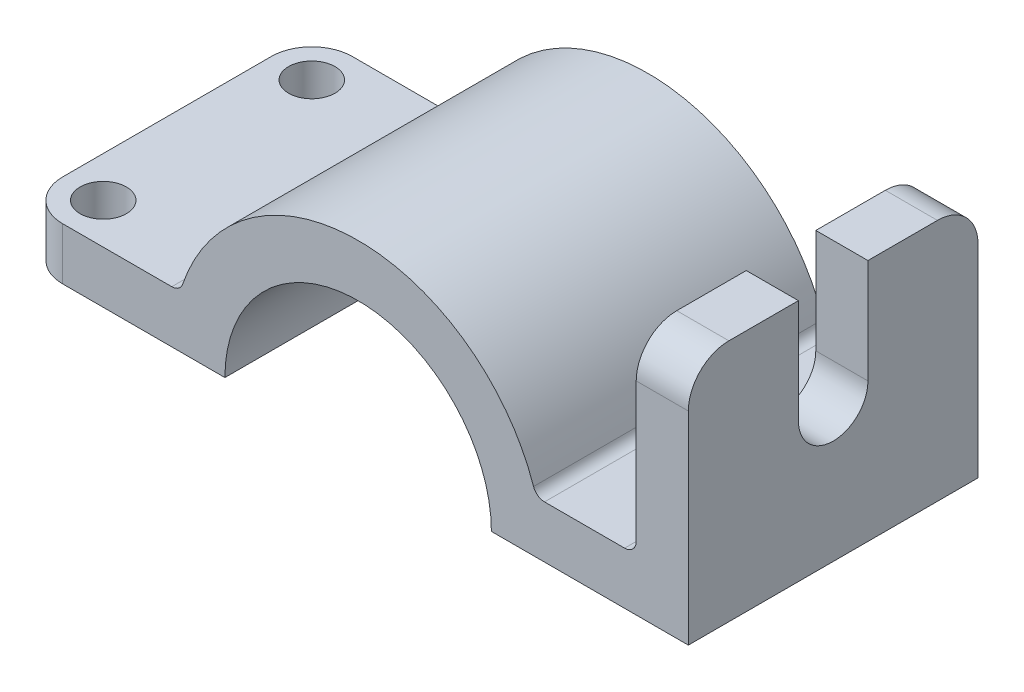
ISO-10303-21;
HEADER;
FILE_DESCRIPTION(('STEP AP214'),'2;1');
FILE_NAME('part.step','',(''),(''),'','','');
FILE_SCHEMA(('AUTOMOTIVE_DESIGN { 1 0 10303 214 1 1 1 1 }'));
ENDSEC;
DATA;
#1=APPLICATION_CONTEXT('core data for automotive mechanical design processes');
#2=APPLICATION_PROTOCOL_DEFINITION('international standard','automotive_design',2000,#1);
#3=PRODUCT_CONTEXT('',#1,'mechanical');
#4=PRODUCT('Part','Part','',(#3));
#5=PRODUCT_RELATED_PRODUCT_CATEGORY('part','',(#4));
#6=PRODUCT_DEFINITION_FORMATION('','',#4);
#7=PRODUCT_DEFINITION_CONTEXT('part definition',#1,'design');
#8=PRODUCT_DEFINITION('design','',#6,#7);
#9=PRODUCT_DEFINITION_SHAPE('','',#8);
#10=(LENGTH_UNIT() NAMED_UNIT(*) SI_UNIT(.MILLI.,.METRE.));
#11=(NAMED_UNIT(*) PLANE_ANGLE_UNIT() SI_UNIT($,.RADIAN.));
#12=(NAMED_UNIT(*) SI_UNIT($,.STERADIAN.) SOLID_ANGLE_UNIT());
#13=UNCERTAINTY_MEASURE_WITH_UNIT(LENGTH_MEASURE(1.E-05),#10,'distance_accuracy_value','');
#14=(GEOMETRIC_REPRESENTATION_CONTEXT(3) GLOBAL_UNCERTAINTY_ASSIGNED_CONTEXT((#13)) GLOBAL_UNIT_ASSIGNED_CONTEXT((#10,
#11,#12)) REPRESENTATION_CONTEXT('',''));
#15=CARTESIAN_POINT('',(0.,0.,0.));
#16=DIRECTION('',(0.,0.,1.));
#17=DIRECTION('',(1.,0.,0.));
#18=AXIS2_PLACEMENT_3D('',#15,#16,#17);
#19=CARTESIAN_POINT('',(57.,42.,25.));
#20=DIRECTION('',(0.,-1.,0.));
#21=DIRECTION('',(1.,0.,0.));
#22=AXIS2_PLACEMENT_3D('',#19,#20,#21);
#23=PLANE('',#22);
#24=DIRECTION('',(0.,0.,-1.));
#25=VECTOR('',#24,1.);
#26=CARTESIAN_POINT('',(48.,42.,25.));
#27=LINE('',#26,#25);
#28=CARTESIAN_POINT('',(48.,42.,18.));
#29=VERTEX_POINT('',#28);
#30=CARTESIAN_POINT('',(48.,42.,6.));
#31=VERTEX_POINT('',#30);
#32=EDGE_CURVE('E300',#29,#31,#27,.T.);
#33=ORIENTED_EDGE('',*,*,#32,.F.);
#34=DIRECTION('',(-1.,0.,0.));
#35=VECTOR('',#34,1.);
#36=CARTESIAN_POINT('',(57.,42.,18.));
#37=LINE('',#36,#35);
#38=CARTESIAN_POINT('',(57.,42.,18.));
#39=VERTEX_POINT('',#38);
#40=EDGE_CURVE('E11',#29,#39,#37,.F.);
#41=ORIENTED_EDGE('',*,*,#40,.T.);
#42=DIRECTION('',(0.,0.,-1.));
#43=VECTOR('',#42,1.);
#44=CARTESIAN_POINT('',(57.,42.,25.));
#45=LINE('',#44,#43);
#46=CARTESIAN_POINT('',(57.,42.,6.));
#47=VERTEX_POINT('',#46);
#48=EDGE_CURVE('E297',#39,#47,#45,.T.);
#49=ORIENTED_EDGE('',*,*,#48,.T.);
#50=DIRECTION('',(1.,0.,0.));
#51=VECTOR('',#50,1.);
#52=CARTESIAN_POINT('',(21.1671842700025,42.,6.));
#53=LINE('',#52,#51);
#54=EDGE_CURVE('E214',#31,#47,#53,.T.);
#55=ORIENTED_EDGE('',*,*,#54,.F.);
#56=EDGE_LOOP('',(#33,#41,#49,#55));
#57=FACE_BOUND('',#56,.T.);
#58=ADVANCED_FACE('F41',(#57),#23,.F.);
#59=CARTESIAN_POINT('',(57.,0.,25.));
#60=DIRECTION('',(-1.,0.,0.));
#61=DIRECTION('',(0.,0.,1.));
#62=AXIS2_PLACEMENT_3D('',#59,#60,#61);
#63=PLANE('',#62);
#64=DIRECTION('',(0.,1.,0.));
#65=VECTOR('',#64,1.);
#66=CARTESIAN_POINT('',(57.,0.,-25.));
#67=LINE('',#66,#65);
#68=CARTESIAN_POINT('',(57.,0.,-25.));
#69=VERTEX_POINT('',#68);
#70=CARTESIAN_POINT('',(57.,35.,-25.));
#71=VERTEX_POINT('',#70);
#72=EDGE_CURVE('E251',#69,#71,#67,.T.);
#73=ORIENTED_EDGE('',*,*,#72,.T.);
#74=CARTESIAN_POINT('',(57.,35.,-18.));
#75=DIRECTION('',(-1.,0.,0.));
#76=DIRECTION('',(0.,0.,1.));
#77=AXIS2_PLACEMENT_3D('',#74,#75,#76);
#78=CIRCLE('',#77,7.);
#79=CARTESIAN_POINT('',(57.,42.,-18.));
#80=VERTEX_POINT('',#79);
#81=EDGE_CURVE('E47',#71,#80,#78,.F.);
#82=ORIENTED_EDGE('',*,*,#81,.T.);
#83=CARTESIAN_POINT('',(57.,42.,-6.));
#84=VERTEX_POINT('',#83);
#85=EDGE_CURVE('E208',#84,#80,#45,.T.);
#86=ORIENTED_EDGE('',*,*,#85,.F.);
#87=DIRECTION('',(0.,1.,0.));
#88=VECTOR('',#87,1.);
#89=CARTESIAN_POINT('',(57.,24.,-6.));
#90=LINE('',#89,#88);
#91=CARTESIAN_POINT('',(57.,24.,-6.));
#92=VERTEX_POINT('',#91);
#93=EDGE_CURVE('E183',#92,#84,#90,.T.);
#94=ORIENTED_EDGE('',*,*,#93,.F.);
#95=CARTESIAN_POINT('',(57.,24.,0.));
#96=DIRECTION('',(1.,0.,0.));
#97=DIRECTION('',(0.,0.,-1.));
#98=AXIS2_PLACEMENT_3D('',#95,#96,#97);
#99=CIRCLE('',#98,6.);
#100=CARTESIAN_POINT('',(57.,24.,6.));
#101=VERTEX_POINT('',#100);
#102=EDGE_CURVE('E195',#101,#92,#99,.T.);
#103=ORIENTED_EDGE('',*,*,#102,.F.);
#104=DIRECTION('',(0.,-1.,0.));
#105=VECTOR('',#104,1.);
#106=CARTESIAN_POINT('',(57.,24.,6.));
#107=LINE('',#106,#105);
#108=EDGE_CURVE('E192',#47,#101,#107,.T.);
#109=ORIENTED_EDGE('',*,*,#108,.F.);
#110=ORIENTED_EDGE('',*,*,#48,.F.);
#111=CARTESIAN_POINT('',(57.,35.,18.));
#112=DIRECTION('',(-1.,0.,0.));
#113=DIRECTION('',(0.,0.,1.));
#114=AXIS2_PLACEMENT_3D('',#111,#112,#113);
#115=CIRCLE('',#114,7.);
#116=CARTESIAN_POINT('',(57.,35.,25.));
#117=VERTEX_POINT('',#116);
#118=EDGE_CURVE('E336',#39,#117,#115,.F.);
#119=ORIENTED_EDGE('',*,*,#118,.T.);
#120=DIRECTION('',(0.,1.,0.));
#121=VECTOR('',#120,1.);
#122=CARTESIAN_POINT('',(57.,0.,25.));
#123=LINE('',#122,#121);
#124=CARTESIAN_POINT('',(57.,0.,25.));
#125=VERTEX_POINT('',#124);
#126=EDGE_CURVE('E230',#125,#117,#123,.T.);
#127=ORIENTED_EDGE('',*,*,#126,.F.);
#128=DIRECTION('',(0.,0.,-1.));
#129=VECTOR('',#128,1.);
#130=CARTESIAN_POINT('',(57.,0.,25.));
#131=LINE('',#130,#129);
#132=EDGE_CURVE('E302',#125,#69,#131,.T.);
#133=ORIENTED_EDGE('',*,*,#132,.T.);
#134=EDGE_LOOP('',(#73,#82,#86,#94,#103,#109,#110,#119,#127,#133));
#135=FACE_BOUND('',#134,.T.);
#136=ADVANCED_FACE('F206',(#135),#63,.F.);
#137=CARTESIAN_POINT('',(48.,42.,25.));
#138=DIRECTION('',(1.,0.,0.));
#139=DIRECTION('',(0.,1.,0.));
#140=AXIS2_PLACEMENT_3D('',#137,#138,#139);
#141=PLANE('',#140);
#142=CARTESIAN_POINT('',(48.,42.,-6.));
#143=VERTEX_POINT('',#142);
#144=CARTESIAN_POINT('',(48.,42.,-18.));
#145=VERTEX_POINT('',#144);
#146=EDGE_CURVE('E296',#143,#145,#27,.T.);
#147=ORIENTED_EDGE('',*,*,#146,.T.);
#148=CARTESIAN_POINT('',(48.,35.,-18.));
#149=DIRECTION('',(1.,0.,0.));
#150=DIRECTION('',(0.,1.,0.));
#151=AXIS2_PLACEMENT_3D('',#148,#149,#150);
#152=CIRCLE('',#151,7.);
#153=CARTESIAN_POINT('',(48.,35.,-25.));
#154=VERTEX_POINT('',#153);
#155=EDGE_CURVE('E333',#145,#154,#152,.F.);
#156=ORIENTED_EDGE('',*,*,#155,.T.);
#157=DIRECTION('',(0.,-1.,0.));
#158=VECTOR('',#157,1.);
#159=CARTESIAN_POINT('',(48.,42.,-25.));
#160=LINE('',#159,#158);
#161=CARTESIAN_POINT('',(48.,11.,-25.));
#162=VERTEX_POINT('',#161);
#163=EDGE_CURVE('E254',#154,#162,#160,.T.);
#164=ORIENTED_EDGE('',*,*,#163,.T.);
#165=DIRECTION('',(0.,0.,-1.));
#166=VECTOR('',#165,1.);
#167=CARTESIAN_POINT('',(48.,11.,25.));
#168=LINE('',#167,#166);
#169=CARTESIAN_POINT('',(48.,11.,25.));
#170=VERTEX_POINT('',#169);
#171=EDGE_CURVE('E294',#170,#162,#168,.T.);
#172=ORIENTED_EDGE('',*,*,#171,.F.);
#173=DIRECTION('',(0.,-1.,0.));
#174=VECTOR('',#173,1.);
#175=CARTESIAN_POINT('',(48.,42.,25.));
#176=LINE('',#175,#174);
#177=CARTESIAN_POINT('',(48.,35.,25.));
#178=VERTEX_POINT('',#177);
#179=EDGE_CURVE('E231',#178,#170,#176,.T.);
#180=ORIENTED_EDGE('',*,*,#179,.F.);
#181=CARTESIAN_POINT('',(48.,35.,18.));
#182=DIRECTION('',(1.,0.,0.));
#183=DIRECTION('',(0.,1.,0.));
#184=AXIS2_PLACEMENT_3D('',#181,#182,#183);
#185=CIRCLE('',#184,7.);
#186=EDGE_CURVE('E61',#178,#29,#185,.F.);
#187=ORIENTED_EDGE('',*,*,#186,.T.);
#188=ORIENTED_EDGE('',*,*,#32,.T.);
#189=DIRECTION('',(0.,1.,0.));
#190=VECTOR('',#189,1.);
#191=CARTESIAN_POINT('',(48.,24.,6.));
#192=LINE('',#191,#190);
#193=CARTESIAN_POINT('',(48.,24.,6.));
#194=VERTEX_POINT('',#193);
#195=EDGE_CURVE('E212',#194,#31,#192,.T.);
#196=ORIENTED_EDGE('',*,*,#195,.F.);
#197=CARTESIAN_POINT('',(48.,24.,0.));
#198=DIRECTION('',(1.,0.,0.));
#199=DIRECTION('',(0.,1.,0.));
#200=AXIS2_PLACEMENT_3D('',#197,#198,#199);
#201=CIRCLE('',#200,6.);
#202=CARTESIAN_POINT('',(48.,24.,-6.));
#203=VERTEX_POINT('',#202);
#204=EDGE_CURVE('E222',#203,#194,#201,.F.);
#205=ORIENTED_EDGE('',*,*,#204,.F.);
#206=DIRECTION('',(0.,-1.,0.));
#207=VECTOR('',#206,1.);
#208=CARTESIAN_POINT('',(48.,24.,-6.));
#209=LINE('',#208,#207);
#210=EDGE_CURVE('E190',#143,#203,#209,.T.);
#211=ORIENTED_EDGE('',*,*,#210,.F.);
#212=EDGE_LOOP('',(#147,#156,#164,#172,#180,#187,#188,#196,#205,#211));
#213=FACE_BOUND('',#212,.T.);
#214=ADVANCED_FACE('F349',(#213),#141,.F.);
#215=CARTESIAN_POINT('',(0.,0.,25.));
#216=DIRECTION('',(0.,0.,-1.));
#217=DIRECTION('',(-1.,0.,0.));
#218=AXIS2_PLACEMENT_3D('',#215,#216,#217);
#219=CYLINDRICAL_SURFACE('',#218,23.);
#220=CARTESIAN_POINT('',(0.,0.,-25.));
#221=DIRECTION('',(0.,0.,-1.));
#222=DIRECTION('',(-1.,0.,0.));
#223=AXIS2_PLACEMENT_3D('',#220,#221,#222);
#224=CIRCLE('',#223,23.);
#225=CARTESIAN_POINT('',(-23.,0.,-25.));
#226=VERTEX_POINT('',#225);
#227=CARTESIAN_POINT('',(23.,0.,-25.));
#228=VERTEX_POINT('',#227);
#229=EDGE_CURVE('E219',#226,#228,#224,.T.);
#230=ORIENTED_EDGE('',*,*,#229,.T.);
#231=DIRECTION('',(0.,0.,-1.));
#232=VECTOR('',#231,1.);
#233=CARTESIAN_POINT('',(23.,0.,25.));
#234=LINE('',#233,#232);
#235=CARTESIAN_POINT('',(23.,0.,25.));
#236=VERTEX_POINT('',#235);
#237=EDGE_CURVE('E305',#236,#228,#234,.T.);
#238=ORIENTED_EDGE('',*,*,#237,.F.);
#239=CARTESIAN_POINT('',(0.,0.,25.));
#240=DIRECTION('',(0.,0.,-1.));
#241=DIRECTION('',(-1.,0.,0.));
#242=AXIS2_PLACEMENT_3D('',#239,#240,#241);
#243=CIRCLE('',#242,23.);
#244=CARTESIAN_POINT('',(-23.,0.,25.));
#245=VERTEX_POINT('',#244);
#246=EDGE_CURVE('E225',#245,#236,#243,.T.);
#247=ORIENTED_EDGE('',*,*,#246,.F.);
#248=DIRECTION('',(0.,0.,-1.));
#249=VECTOR('',#248,1.);
#250=CARTESIAN_POINT('',(-23.,0.,25.));
#251=LINE('',#250,#249);
#252=EDGE_CURVE('E249',#245,#226,#251,.T.);
#253=ORIENTED_EDGE('',*,*,#252,.T.);
#254=EDGE_LOOP('',(#230,#238,#247,#253));
#255=FACE_BOUND('',#254,.T.);
#256=ADVANCED_FACE('F423',(#255),#219,.F.);
#257=CARTESIAN_POINT('',(23.,0.,25.));
#258=DIRECTION('',(0.,1.,0.));
#259=DIRECTION('',(0.,0.,1.));
#260=AXIS2_PLACEMENT_3D('',#257,#258,#259);
#261=PLANE('',#260);
#262=DIRECTION('',(1.,0.,0.));
#263=VECTOR('',#262,1.);
#264=CARTESIAN_POINT('',(23.,0.,-25.));
#265=LINE('',#264,#263);
#266=EDGE_CURVE('E253',#228,#69,#265,.T.);
#267=ORIENTED_EDGE('',*,*,#266,.T.);
#268=ORIENTED_EDGE('',*,*,#132,.F.);
#269=DIRECTION('',(1.,0.,0.));
#270=VECTOR('',#269,1.);
#271=CARTESIAN_POINT('',(23.,0.,25.));
#272=LINE('',#271,#270);
#273=EDGE_CURVE('E223',#236,#125,#272,.T.);
#274=ORIENTED_EDGE('',*,*,#273,.F.);
#275=ORIENTED_EDGE('',*,*,#237,.T.);
#276=EDGE_LOOP('',(#267,#268,#274,#275));
#277=FACE_BOUND('',#276,.T.);
#278=ADVANCED_FACE('F424',(#277),#261,.F.);
#279=ORIENTED_EDGE('',*,*,#85,.T.);
#280=DIRECTION('',(-1.,0.,0.));
#281=VECTOR('',#280,1.);
#282=CARTESIAN_POINT('',(48.,42.,-18.));
#283=LINE('',#282,#281);
#284=EDGE_CURVE('E332',#80,#145,#283,.T.);
#285=ORIENTED_EDGE('',*,*,#284,.T.);
#286=ORIENTED_EDGE('',*,*,#146,.F.);
#287=DIRECTION('',(1.,0.,0.));
#288=VECTOR('',#287,1.);
#289=CARTESIAN_POINT('',(21.1671842700025,42.,-6.));
#290=LINE('',#289,#288);
#291=EDGE_CURVE('E191',#143,#84,#290,.T.);
#292=ORIENTED_EDGE('',*,*,#291,.T.);
#293=EDGE_LOOP('',(#279,#285,#286,#292));
#294=FACE_BOUND('',#293,.T.);
#295=ADVANCED_FACE('F343',(#294),#23,.F.);
#296=CARTESIAN_POINT('',(46.,11.,25.));
#297=DIRECTION('',(0.,0.,-1.));
#298=DIRECTION('',(-1.,0.,0.));
#299=AXIS2_PLACEMENT_3D('',#296,#297,#298);
#300=CYLINDRICAL_SURFACE('',#299,2.);
#301=CARTESIAN_POINT('',(46.,11.,-25.));
#302=DIRECTION('',(0.,0.,-1.));
#303=DIRECTION('',(-1.,0.,0.));
#304=AXIS2_PLACEMENT_3D('',#301,#302,#303);
#305=CIRCLE('',#304,2.);
#306=CARTESIAN_POINT('',(46.,9.,-25.));
#307=VERTEX_POINT('',#306);
#308=EDGE_CURVE('E260',#162,#307,#305,.T.);
#309=ORIENTED_EDGE('',*,*,#308,.T.);
#310=DIRECTION('',(0.,0.,-1.));
#311=VECTOR('',#310,1.);
#312=CARTESIAN_POINT('',(46.,9.,25.));
#313=LINE('',#312,#311);
#314=CARTESIAN_POINT('',(46.,9.,25.));
#315=VERTEX_POINT('',#314);
#316=EDGE_CURVE('E292',#315,#307,#313,.T.);
#317=ORIENTED_EDGE('',*,*,#316,.F.);
#318=CARTESIAN_POINT('',(46.,11.,25.));
#319=DIRECTION('',(0.,0.,-1.));
#320=DIRECTION('',(-1.,0.,0.));
#321=AXIS2_PLACEMENT_3D('',#318,#319,#320);
#322=CIRCLE('',#321,2.);
#323=EDGE_CURVE('E234',#170,#315,#322,.T.);
#324=ORIENTED_EDGE('',*,*,#323,.F.);
#325=ORIENTED_EDGE('',*,*,#171,.T.);
#326=EDGE_LOOP('',(#309,#317,#324,#325));
#327=FACE_BOUND('',#326,.T.);
#328=ADVANCED_FACE('F358',(#327),#300,.F.);
#329=CARTESIAN_POINT('',(46.,9.,25.));
#330=DIRECTION('',(0.,-1.,0.));
#331=DIRECTION('',(1.,0.,0.));
#332=AXIS2_PLACEMENT_3D('',#329,#330,#331);
#333=PLANE('',#332);
#334=DIRECTION('',(-1.,0.,0.));
#335=VECTOR('',#334,1.);
#336=CARTESIAN_POINT('',(46.,9.,-25.));
#337=LINE('',#336,#335);
#338=CARTESIAN_POINT('',(32.1714158842908,9.,-25.));
#339=VERTEX_POINT('',#338);
#340=EDGE_CURVE('E259',#307,#339,#337,.T.);
#341=ORIENTED_EDGE('',*,*,#340,.T.);
#342=DIRECTION('',(0.,0.,-1.));
#343=VECTOR('',#342,1.);
#344=CARTESIAN_POINT('',(32.1714158842908,9.,25.));
#345=LINE('',#344,#343);
#346=CARTESIAN_POINT('',(32.1714158842908,9.,25.));
#347=VERTEX_POINT('',#346);
#348=EDGE_CURVE('E289',#347,#339,#345,.T.);
#349=ORIENTED_EDGE('',*,*,#348,.F.);
#350=DIRECTION('',(-1.,0.,0.));
#351=VECTOR('',#350,1.);
#352=CARTESIAN_POINT('',(46.,9.,25.));
#353=LINE('',#352,#351);
#354=EDGE_CURVE('E235',#315,#347,#353,.T.);
#355=ORIENTED_EDGE('',*,*,#354,.F.);
#356=ORIENTED_EDGE('',*,*,#316,.T.);
#357=EDGE_LOOP('',(#341,#349,#355,#356));
#358=FACE_BOUND('',#357,.T.);
#359=ADVANCED_FACE('F361',(#358),#333,.F.);
#360=CARTESIAN_POINT('',(32.1714158842908,11.,25.));
#361=DIRECTION('',(0.,0.,-1.));
#362=DIRECTION('',(-1.,0.,0.));
#363=AXIS2_PLACEMENT_3D('',#360,#361,#362);
#364=CYLINDRICAL_SURFACE('',#363,2.);
#365=CARTESIAN_POINT('',(32.1714158842908,11.,-25.));
#366=DIRECTION('',(0.,0.,-1.));
#367=DIRECTION('',(-1.,0.,0.));
#368=AXIS2_PLACEMENT_3D('',#365,#366,#367);
#369=CIRCLE('',#368,2.);
#370=CARTESIAN_POINT('',(30.2789796558031,10.3529411764706,-25.));
#371=VERTEX_POINT('',#370);
#372=EDGE_CURVE('E261',#339,#371,#369,.T.);
#373=ORIENTED_EDGE('',*,*,#372,.T.);
#374=DIRECTION('',(0.,0.,-1.));
#375=VECTOR('',#374,1.);
#376=CARTESIAN_POINT('',(30.2789796558031,10.3529411764706,25.));
#377=LINE('',#376,#375);
#378=CARTESIAN_POINT('',(30.2789796558031,10.3529411764706,25.));
#379=VERTEX_POINT('',#378);
#380=EDGE_CURVE('E282',#379,#371,#377,.T.);
#381=ORIENTED_EDGE('',*,*,#380,.F.);
#382=CARTESIAN_POINT('',(32.1714158842908,11.,25.));
#383=DIRECTION('',(0.,0.,-1.));
#384=DIRECTION('',(-1.,0.,0.));
#385=AXIS2_PLACEMENT_3D('',#382,#383,#384);
#386=CIRCLE('',#385,2.);
#387=EDGE_CURVE('E240',#347,#379,#386,.T.);
#388=ORIENTED_EDGE('',*,*,#387,.F.);
#389=ORIENTED_EDGE('',*,*,#348,.T.);
#390=EDGE_LOOP('',(#373,#381,#388,#389));
#391=FACE_BOUND('',#390,.T.);
#392=ADVANCED_FACE('F588',(#391),#364,.F.);
#393=CARTESIAN_POINT('',(0.,0.,25.));
#394=DIRECTION('',(0.,0.,-1.));
#395=DIRECTION('',(-1.,0.,0.));
#396=AXIS2_PLACEMENT_3D('',#393,#394,#395);
#397=CYLINDRICAL_SURFACE('',#396,32.);
#398=CARTESIAN_POINT('',(0.,0.,-25.));
#399=DIRECTION('',(0.,0.,1.));
#400=DIRECTION('',(-1.,0.,0.));
#401=AXIS2_PLACEMENT_3D('',#398,#399,#400);
#402=CIRCLE('',#401,32.);
#403=CARTESIAN_POINT('',(-30.2789796558031,10.3529411764706,-25.));
#404=VERTEX_POINT('',#403);
#405=EDGE_CURVE('E263',#371,#404,#402,.T.);
#406=ORIENTED_EDGE('',*,*,#405,.T.);
#407=DIRECTION('',(0.,0.,-1.));
#408=VECTOR('',#407,1.);
#409=CARTESIAN_POINT('',(-30.2789796558031,10.3529411764706,25.));
#410=LINE('',#409,#408);
#411=CARTESIAN_POINT('',(-30.2789796558031,10.3529411764706,25.));
#412=VERTEX_POINT('',#411);
#413=EDGE_CURVE('E281',#412,#404,#410,.T.);
#414=ORIENTED_EDGE('',*,*,#413,.F.);
#415=CARTESIAN_POINT('',(0.,0.,25.));
#416=DIRECTION('',(0.,0.,1.));
#417=DIRECTION('',(-1.,0.,0.));
#418=AXIS2_PLACEMENT_3D('',#415,#416,#417);
#419=CIRCLE('',#418,32.);
#420=EDGE_CURVE('E239',#379,#412,#419,.T.);
#421=ORIENTED_EDGE('',*,*,#420,.F.);
#422=ORIENTED_EDGE('',*,*,#380,.T.);
#423=EDGE_LOOP('',(#406,#414,#421,#422));
#424=FACE_BOUND('',#423,.T.);
#425=ADVANCED_FACE('F577',(#424),#397,.T.);
#426=CARTESIAN_POINT('',(-32.1714158842908,11.,25.));
#427=DIRECTION('',(0.,0.,-1.));
#428=DIRECTION('',(-1.,0.,0.));
#429=AXIS2_PLACEMENT_3D('',#426,#427,#428);
#430=CYLINDRICAL_SURFACE('',#429,2.);
#431=CARTESIAN_POINT('',(-32.1714158842908,11.,-25.));
#432=DIRECTION('',(0.,0.,-1.));
#433=DIRECTION('',(1.,0.,0.));
#434=AXIS2_PLACEMENT_3D('',#431,#432,#433);
#435=CIRCLE('',#434,2.);
#436=CARTESIAN_POINT('',(-32.1714158842908,9.,-25.));
#437=VERTEX_POINT('',#436);
#438=EDGE_CURVE('E264',#404,#437,#435,.T.);
#439=ORIENTED_EDGE('',*,*,#438,.T.);
#440=DIRECTION('',(0.,0.,-1.));
#441=VECTOR('',#440,1.);
#442=CARTESIAN_POINT('',(-32.1714158842908,9.,25.));
#443=LINE('',#442,#441);
#444=CARTESIAN_POINT('',(-32.1714158842908,9.,25.));
#445=VERTEX_POINT('',#444);
#446=EDGE_CURVE('E276',#445,#437,#443,.T.);
#447=ORIENTED_EDGE('',*,*,#446,.F.);
#448=CARTESIAN_POINT('',(-32.1714158842908,11.,25.));
#449=DIRECTION('',(0.,0.,-1.));
#450=DIRECTION('',(1.,0.,0.));
#451=AXIS2_PLACEMENT_3D('',#448,#449,#450);
#452=CIRCLE('',#451,2.);
#453=EDGE_CURVE('E244',#412,#445,#452,.T.);
#454=ORIENTED_EDGE('',*,*,#453,.F.);
#455=ORIENTED_EDGE('',*,*,#413,.T.);
#456=EDGE_LOOP('',(#439,#447,#454,#455));
#457=FACE_BOUND('',#456,.T.);
#458=ADVANCED_FACE('F399',(#457),#430,.F.);
#459=CARTESIAN_POINT('',(-58.,9.,25.));
#460=DIRECTION('',(0.,-1.,0.));
#461=DIRECTION('',(0.,0.,-1.));
#462=AXIS2_PLACEMENT_3D('',#459,#460,#461);
#463=PLANE('',#462);
#464=CARTESIAN_POINT('',(-51.,9.,-18.));
#465=DIRECTION('',(0.,1.,0.));
#466=DIRECTION('',(0.,0.,1.));
#467=AXIS2_PLACEMENT_3D('',#464,#465,#466);
#468=CIRCLE('',#467,4.);
#469=CARTESIAN_POINT('',(-51.,9.,-14.));
#470=VERTEX_POINT('',#469);
#471=EDGE_CURVE('E382',#470,#470,#468,.T.);
#472=ORIENTED_EDGE('',*,*,#471,.F.);
#473=EDGE_LOOP('',(#472));
#474=FACE_BOUND('',#473,.T.);
#475=CARTESIAN_POINT('',(-51.,9.,18.));
#476=DIRECTION('',(0.,1.,0.));
#477=DIRECTION('',(0.,0.,1.));
#478=AXIS2_PLACEMENT_3D('',#475,#476,#477);
#479=CIRCLE('',#478,4.);
#480=CARTESIAN_POINT('',(-51.,9.,22.));
#481=VERTEX_POINT('',#480);
#482=EDGE_CURVE('E383',#481,#481,#479,.T.);
#483=ORIENTED_EDGE('',*,*,#482,.F.);
#484=EDGE_LOOP('',(#483));
#485=FACE_BOUND('',#484,.T.);
#486=DIRECTION('',(0.,0.,-1.));
#487=VECTOR('',#486,1.);
#488=CARTESIAN_POINT('',(-58.,9.,25.));
#489=LINE('',#488,#487);
#490=CARTESIAN_POINT('',(-58.,9.,18.));
#491=VERTEX_POINT('',#490);
#492=CARTESIAN_POINT('',(-58.,9.,-18.));
#493=VERTEX_POINT('',#492);
#494=EDGE_CURVE('E277',#491,#493,#489,.T.);
#495=ORIENTED_EDGE('',*,*,#494,.F.);
#496=CARTESIAN_POINT('',(-51.,9.,18.));
#497=DIRECTION('',(0.,-1.,0.));
#498=DIRECTION('',(0.,0.,-1.));
#499=AXIS2_PLACEMENT_3D('',#496,#497,#498);
#500=CIRCLE('',#499,7.);
#501=CARTESIAN_POINT('',(-51.,9.,25.));
#502=VERTEX_POINT('',#501);
#503=EDGE_CURVE('E324',#491,#502,#500,.F.);
#504=ORIENTED_EDGE('',*,*,#503,.T.);
#505=DIRECTION('',(-1.,0.,0.));
#506=VECTOR('',#505,1.);
#507=CARTESIAN_POINT('',(-58.,9.,25.));
#508=LINE('',#507,#506);
#509=EDGE_CURVE('E245',#445,#502,#508,.T.);
#510=ORIENTED_EDGE('',*,*,#509,.F.);
#511=ORIENTED_EDGE('',*,*,#446,.T.);
#512=DIRECTION('',(-1.,0.,0.));
#513=VECTOR('',#512,1.);
#514=CARTESIAN_POINT('',(-58.,9.,-25.));
#515=LINE('',#514,#513);
#516=CARTESIAN_POINT('',(-51.,9.,-25.));
#517=VERTEX_POINT('',#516);
#518=EDGE_CURVE('E270',#437,#517,#515,.T.);
#519=ORIENTED_EDGE('',*,*,#518,.T.);
#520=CARTESIAN_POINT('',(-51.,9.,-18.));
#521=DIRECTION('',(0.,-1.,0.));
#522=DIRECTION('',(0.,0.,-1.));
#523=AXIS2_PLACEMENT_3D('',#520,#521,#522);
#524=CIRCLE('',#523,7.);
#525=EDGE_CURVE('E323',#517,#493,#524,.F.);
#526=ORIENTED_EDGE('',*,*,#525,.T.);
#527=EDGE_LOOP('',(#495,#504,#510,#511,#519,#526));
#528=FACE_BOUND('',#527,.T.);
#529=ADVANCED_FACE('F393',(#474,#485,#528),#463,.F.);
#530=CARTESIAN_POINT('',(-58.,0.,25.));
#531=DIRECTION('',(1.,0.,0.));
#532=DIRECTION('',(0.,1.,0.));
#533=AXIS2_PLACEMENT_3D('',#530,#531,#532);
#534=PLANE('',#533);
#535=DIRECTION('',(0.,0.,-1.));
#536=VECTOR('',#535,1.);
#537=CARTESIAN_POINT('',(-58.,0.,25.));
#538=LINE('',#537,#536);
#539=CARTESIAN_POINT('',(-58.,0.,18.));
#540=VERTEX_POINT('',#539);
#541=CARTESIAN_POINT('',(-58.,0.,-18.));
#542=VERTEX_POINT('',#541);
#543=EDGE_CURVE('E272',#540,#542,#538,.T.);
#544=ORIENTED_EDGE('',*,*,#543,.F.);
#545=DIRECTION('',(0.,-1.,0.));
#546=VECTOR('',#545,1.);
#547=CARTESIAN_POINT('',(-58.,0.,18.));
#548=LINE('',#547,#546);
#549=EDGE_CURVE('E321',#540,#491,#548,.F.);
#550=ORIENTED_EDGE('',*,*,#549,.T.);
#551=ORIENTED_EDGE('',*,*,#494,.T.);
#552=DIRECTION('',(0.,-1.,0.));
#553=VECTOR('',#552,1.);
#554=CARTESIAN_POINT('',(-58.,0.,-18.));
#555=LINE('',#554,#553);
#556=EDGE_CURVE('E318',#493,#542,#555,.T.);
#557=ORIENTED_EDGE('',*,*,#556,.T.);
#558=EDGE_LOOP('',(#544,#550,#551,#557));
#559=FACE_BOUND('',#558,.T.);
#560=ADVANCED_FACE('F397',(#559),#534,.F.);
#561=CARTESIAN_POINT('',(-23.,0.,25.));
#562=DIRECTION('',(0.,1.,0.));
#563=DIRECTION('',(-1.,0.,0.));
#564=AXIS2_PLACEMENT_3D('',#561,#562,#563);
#565=PLANE('',#564);
#566=CARTESIAN_POINT('',(-51.,0.,-18.));
#567=DIRECTION('',(0.,1.,0.));
#568=DIRECTION('',(-1.,0.,0.));
#569=AXIS2_PLACEMENT_3D('',#566,#567,#568);
#570=CIRCLE('',#569,4.);
#571=CARTESIAN_POINT('',(-55.,0.,-18.));
#572=VERTEX_POINT('',#571);
#573=EDGE_CURVE('E205',#572,#572,#570,.F.);
#574=ORIENTED_EDGE('',*,*,#573,.F.);
#575=EDGE_LOOP('',(#574));
#576=FACE_BOUND('',#575,.T.);
#577=CARTESIAN_POINT('',(-51.,0.,18.));
#578=DIRECTION('',(0.,1.,0.));
#579=DIRECTION('',(-1.,0.,0.));
#580=AXIS2_PLACEMENT_3D('',#577,#578,#579);
#581=CIRCLE('',#580,4.);
#582=CARTESIAN_POINT('',(-55.,0.,18.));
#583=VERTEX_POINT('',#582);
#584=EDGE_CURVE('E379',#583,#583,#581,.F.);
#585=ORIENTED_EDGE('',*,*,#584,.F.);
#586=EDGE_LOOP('',(#585));
#587=FACE_BOUND('',#586,.T.);
#588=DIRECTION('',(1.,0.,0.));
#589=VECTOR('',#588,1.);
#590=CARTESIAN_POINT('',(-23.,0.,25.));
#591=LINE('',#590,#589);
#592=CARTESIAN_POINT('',(-51.,0.,25.));
#593=VERTEX_POINT('',#592);
#594=EDGE_CURVE('E246',#593,#245,#591,.T.);
#595=ORIENTED_EDGE('',*,*,#594,.F.);
#596=CARTESIAN_POINT('',(-51.,0.,18.));
#597=DIRECTION('',(0.,1.,0.));
#598=DIRECTION('',(-1.,0.,0.));
#599=AXIS2_PLACEMENT_3D('',#596,#597,#598);
#600=CIRCLE('',#599,7.);
#601=EDGE_CURVE('E316',#593,#540,#600,.F.);
#602=ORIENTED_EDGE('',*,*,#601,.T.);
#603=ORIENTED_EDGE('',*,*,#543,.T.);
#604=CARTESIAN_POINT('',(-51.,0.,-18.));
#605=DIRECTION('',(0.,1.,0.));
#606=DIRECTION('',(-1.,0.,0.));
#607=AXIS2_PLACEMENT_3D('',#604,#605,#606);
#608=CIRCLE('',#607,7.);
#609=CARTESIAN_POINT('',(-51.,0.,-25.));
#610=VERTEX_POINT('',#609);
#611=EDGE_CURVE('E314',#542,#610,#608,.F.);
#612=ORIENTED_EDGE('',*,*,#611,.T.);
#613=DIRECTION('',(1.,0.,0.));
#614=VECTOR('',#613,1.);
#615=CARTESIAN_POINT('',(-23.,0.,-25.));
#616=LINE('',#615,#614);
#617=EDGE_CURVE('E229',#610,#226,#616,.T.);
#618=ORIENTED_EDGE('',*,*,#617,.T.);
#619=ORIENTED_EDGE('',*,*,#252,.F.);
#620=EDGE_LOOP('',(#595,#602,#603,#612,#618,#619));
#621=FACE_BOUND('',#620,.T.);
#622=ADVANCED_FACE('F415',(#576,#587,#621),#565,.F.);
#623=CARTESIAN_POINT('',(0.,0.,25.));
#624=DIRECTION('',(0.,0.,-1.));
#625=DIRECTION('',(-1.,0.,0.));
#626=AXIS2_PLACEMENT_3D('',#623,#624,#625);
#627=PLANE('',#626);
#628=ORIENTED_EDGE('',*,*,#509,.T.);
#629=DIRECTION('',(0.,-1.,0.));
#630=VECTOR('',#629,1.);
#631=CARTESIAN_POINT('',(-51.,0.,25.));
#632=LINE('',#631,#630);
#633=EDGE_CURVE('E313',#502,#593,#632,.T.);
#634=ORIENTED_EDGE('',*,*,#633,.T.);
#635=ORIENTED_EDGE('',*,*,#594,.T.);
#636=ORIENTED_EDGE('',*,*,#246,.T.);
#637=ORIENTED_EDGE('',*,*,#273,.T.);
#638=ORIENTED_EDGE('',*,*,#126,.T.);
#639=DIRECTION('',(-1.,0.,0.));
#640=VECTOR('',#639,1.);
#641=CARTESIAN_POINT('',(0.,35.,25.));
#642=LINE('',#641,#640);
#643=EDGE_CURVE('E306',#117,#178,#642,.T.);
#644=ORIENTED_EDGE('',*,*,#643,.T.);
#645=ORIENTED_EDGE('',*,*,#179,.T.);
#646=ORIENTED_EDGE('',*,*,#323,.T.);
#647=ORIENTED_EDGE('',*,*,#354,.T.);
#648=ORIENTED_EDGE('',*,*,#387,.T.);
#649=ORIENTED_EDGE('',*,*,#420,.T.);
#650=ORIENTED_EDGE('',*,*,#453,.T.);
#651=EDGE_LOOP('',(#628,#634,#635,#636,#637,#638,#644,#645,#646,#647,#648,#649,#650));
#652=FACE_BOUND('',#651,.T.);
#653=ADVANCED_FACE('F370',(#652),#627,.F.);
#654=CARTESIAN_POINT('',(0.,0.,-25.));
#655=DIRECTION('',(0.,0.,-1.));
#656=DIRECTION('',(-1.,0.,0.));
#657=AXIS2_PLACEMENT_3D('',#654,#655,#656);
#658=PLANE('',#657);
#659=ORIENTED_EDGE('',*,*,#617,.F.);
#660=DIRECTION('',(0.,-1.,0.));
#661=VECTOR('',#660,1.);
#662=CARTESIAN_POINT('',(-51.,8.99999999999999,-25.));
#663=LINE('',#662,#661);
#664=EDGE_CURVE('E328',#610,#517,#663,.F.);
#665=ORIENTED_EDGE('',*,*,#664,.T.);
#666=ORIENTED_EDGE('',*,*,#518,.F.);
#667=ORIENTED_EDGE('',*,*,#438,.F.);
#668=ORIENTED_EDGE('',*,*,#405,.F.);
#669=ORIENTED_EDGE('',*,*,#372,.F.);
#670=ORIENTED_EDGE('',*,*,#340,.F.);
#671=ORIENTED_EDGE('',*,*,#308,.F.);
#672=ORIENTED_EDGE('',*,*,#163,.F.);
#673=DIRECTION('',(-1.,0.,0.));
#674=VECTOR('',#673,1.);
#675=CARTESIAN_POINT('',(57.,35.,-25.));
#676=LINE('',#675,#674);
#677=EDGE_CURVE('E330',#154,#71,#676,.F.);
#678=ORIENTED_EDGE('',*,*,#677,.T.);
#679=ORIENTED_EDGE('',*,*,#72,.F.);
#680=ORIENTED_EDGE('',*,*,#266,.F.);
#681=ORIENTED_EDGE('',*,*,#229,.F.);
#682=EDGE_LOOP('',(#659,#665,#666,#667,#668,#669,#670,#671,#672,#678,#679,#680,#681));
#683=FACE_BOUND('',#682,.T.);
#684=ADVANCED_FACE('F353',(#683),#658,.T.);
#685=CARTESIAN_POINT('',(21.1671842700025,24.,0.));
#686=DIRECTION('',(1.,0.,0.));
#687=DIRECTION('',(0.,0.,-1.));
#688=AXIS2_PLACEMENT_3D('',#685,#686,#687);
#689=CYLINDRICAL_SURFACE('',#688,6.);
#690=ORIENTED_EDGE('',*,*,#204,.T.);
#691=DIRECTION('',(1.,0.,0.));
#692=VECTOR('',#691,1.);
#693=CARTESIAN_POINT('',(21.1671842700025,24.,6.));
#694=LINE('',#693,#692);
#695=EDGE_CURVE('E196',#194,#101,#694,.T.);
#696=ORIENTED_EDGE('',*,*,#695,.T.);
#697=ORIENTED_EDGE('',*,*,#102,.T.);
#698=DIRECTION('',(1.,0.,0.));
#699=VECTOR('',#698,1.);
#700=CARTESIAN_POINT('',(21.1671842700025,24.,-6.));
#701=LINE('',#700,#699);
#702=EDGE_CURVE('E182',#203,#92,#701,.T.);
#703=ORIENTED_EDGE('',*,*,#702,.F.);
#704=EDGE_LOOP('',(#690,#696,#697,#703));
#705=FACE_BOUND('',#704,.T.);
#706=ADVANCED_FACE('F198',(#705),#689,.F.);
#707=CARTESIAN_POINT('',(21.1671842700025,24.,6.));
#708=DIRECTION('',(0.,0.,1.));
#709=DIRECTION('',(0.,-1.,0.));
#710=AXIS2_PLACEMENT_3D('',#707,#708,#709);
#711=PLANE('',#710);
#712=ORIENTED_EDGE('',*,*,#195,.T.);
#713=ORIENTED_EDGE('',*,*,#54,.T.);
#714=ORIENTED_EDGE('',*,*,#108,.T.);
#715=ORIENTED_EDGE('',*,*,#695,.F.);
#716=EDGE_LOOP('',(#712,#713,#714,#715));
#717=FACE_BOUND('',#716,.T.);
#718=ADVANCED_FACE('F376',(#717),#711,.F.);
#719=CARTESIAN_POINT('',(21.1671842700025,24.,-6.));
#720=DIRECTION('',(0.,0.,-1.));
#721=DIRECTION('',(0.,1.,0.));
#722=AXIS2_PLACEMENT_3D('',#719,#720,#721);
#723=PLANE('',#722);
#724=ORIENTED_EDGE('',*,*,#210,.T.);
#725=ORIENTED_EDGE('',*,*,#702,.T.);
#726=ORIENTED_EDGE('',*,*,#93,.T.);
#727=ORIENTED_EDGE('',*,*,#291,.F.);
#728=EDGE_LOOP('',(#724,#725,#726,#727));
#729=FACE_BOUND('',#728,.T.);
#730=ADVANCED_FACE('F181',(#729),#723,.F.);
#731=CARTESIAN_POINT('',(-51.,0.,18.));
#732=DIRECTION('',(0.,-1.,0.));
#733=DIRECTION('',(1.,0.,0.));
#734=AXIS2_PLACEMENT_3D('',#731,#732,#733);
#735=CYLINDRICAL_SURFACE('',#734,7.);
#736=ORIENTED_EDGE('',*,*,#503,.F.);
#737=ORIENTED_EDGE('',*,*,#549,.F.);
#738=ORIENTED_EDGE('',*,*,#601,.F.);
#739=ORIENTED_EDGE('',*,*,#633,.F.);
#740=EDGE_LOOP('',(#736,#737,#738,#739));
#741=FACE_BOUND('',#740,.T.);
#742=ADVANCED_FACE('F411',(#741),#735,.T.);
#743=CARTESIAN_POINT('',(-51.,0.,-18.));
#744=DIRECTION('',(0.,1.,0.));
#745=DIRECTION('',(-1.,0.,0.));
#746=AXIS2_PLACEMENT_3D('',#743,#744,#745);
#747=CYLINDRICAL_SURFACE('',#746,7.);
#748=ORIENTED_EDGE('',*,*,#525,.F.);
#749=ORIENTED_EDGE('',*,*,#664,.F.);
#750=ORIENTED_EDGE('',*,*,#611,.F.);
#751=ORIENTED_EDGE('',*,*,#556,.F.);
#752=EDGE_LOOP('',(#748,#749,#750,#751));
#753=FACE_BOUND('',#752,.T.);
#754=ADVANCED_FACE('F428',(#753),#747,.T.);
#755=CARTESIAN_POINT('',(57.,35.,-18.));
#756=DIRECTION('',(1.,0.,0.));
#757=DIRECTION('',(0.,1.,0.));
#758=AXIS2_PLACEMENT_3D('',#755,#756,#757);
#759=CYLINDRICAL_SURFACE('',#758,7.);
#760=ORIENTED_EDGE('',*,*,#81,.F.);
#761=ORIENTED_EDGE('',*,*,#677,.F.);
#762=ORIENTED_EDGE('',*,*,#155,.F.);
#763=ORIENTED_EDGE('',*,*,#284,.F.);
#764=EDGE_LOOP('',(#760,#761,#762,#763));
#765=FACE_BOUND('',#764,.T.);
#766=ADVANCED_FACE('F350',(#765),#759,.T.);
#767=CARTESIAN_POINT('',(0.,35.,18.));
#768=DIRECTION('',(-1.,0.,0.));
#769=DIRECTION('',(0.,-1.,0.));
#770=AXIS2_PLACEMENT_3D('',#767,#768,#769);
#771=CYLINDRICAL_SURFACE('',#770,7.);
#772=ORIENTED_EDGE('',*,*,#118,.F.);
#773=ORIENTED_EDGE('',*,*,#40,.F.);
#774=ORIENTED_EDGE('',*,*,#186,.F.);
#775=ORIENTED_EDGE('',*,*,#643,.F.);
#776=EDGE_LOOP('',(#772,#773,#774,#775));
#777=FACE_BOUND('',#776,.T.);
#778=ADVANCED_FACE('F43',(#777),#771,.T.);
#779=CARTESIAN_POINT('',(-51.,-11.3137084989848,18.));
#780=DIRECTION('',(0.,1.,0.));
#781=DIRECTION('',(0.,0.,1.));
#782=AXIS2_PLACEMENT_3D('',#779,#780,#781);
#783=CYLINDRICAL_SURFACE('',#782,4.);
#784=ORIENTED_EDGE('',*,*,#584,.T.);
#785=EDGE_LOOP('',(#784));
#786=FACE_BOUND('',#785,.T.);
#787=ORIENTED_EDGE('',*,*,#482,.T.);
#788=EDGE_LOOP('',(#787));
#789=FACE_BOUND('',#788,.T.);
#790=ADVANCED_FACE('F462',(#786,#789),#783,.F.);
#791=CARTESIAN_POINT('',(-51.,-11.3137084989848,-18.));
#792=DIRECTION('',(0.,1.,0.));
#793=DIRECTION('',(0.,0.,1.));
#794=AXIS2_PLACEMENT_3D('',#791,#792,#793);
#795=CYLINDRICAL_SURFACE('',#794,4.);
#796=ORIENTED_EDGE('',*,*,#573,.T.);
#797=EDGE_LOOP('',(#796));
#798=FACE_BOUND('',#797,.T.);
#799=ORIENTED_EDGE('',*,*,#471,.T.);
#800=EDGE_LOOP('',(#799));
#801=FACE_BOUND('',#800,.T.);
#802=ADVANCED_FACE('F391',(#798,#801),#795,.F.);
#803=CLOSED_SHELL('',(#58,#136,#214,#256,#278,#295,#328,#359,#392,#425,#458,#529,#560,#622,#653,
#684,#706,#718,#730,#742,#754,#766,#778,#790,#802));
#804=MANIFOLD_SOLID_BREP('B2',#803);
#805=ADVANCED_BREP_SHAPE_REPRESENTATION('',(#18,#804),#14);
#806=SHAPE_DEFINITION_REPRESENTATION(#9,#805);
ENDSEC;
END-ISO-10303-21;
